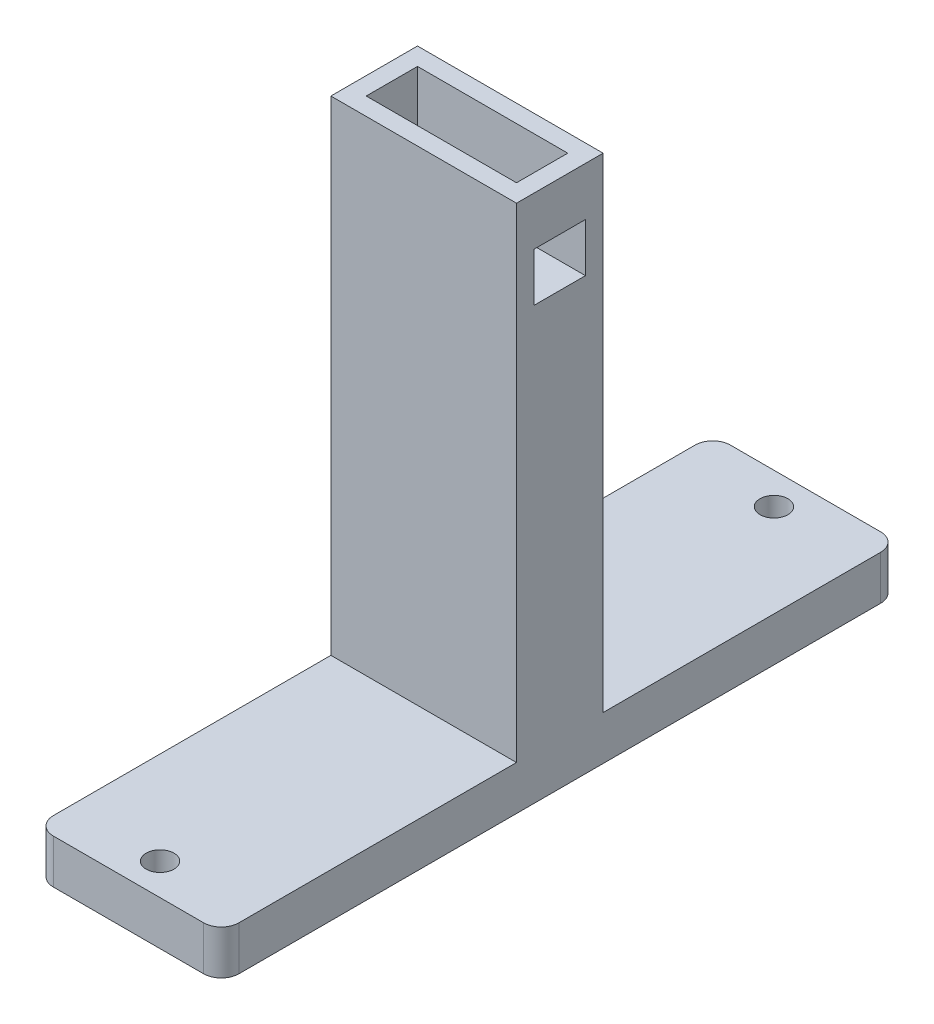
ISO-10303-21;
HEADER;
FILE_DESCRIPTION(('STEP AP214'),'2;1');
FILE_NAME('part.step','',(''),(''),'','','');
FILE_SCHEMA(('AUTOMOTIVE_DESIGN { 1 0 10303 214 1 1 1 1 }'));
ENDSEC;
DATA;
#1=APPLICATION_CONTEXT('core data for automotive mechanical design processes');
#2=APPLICATION_PROTOCOL_DEFINITION('international standard','automotive_design',2000,#1);
#3=PRODUCT_CONTEXT('',#1,'mechanical');
#4=PRODUCT('Part','Part','',(#3));
#5=PRODUCT_RELATED_PRODUCT_CATEGORY('part','',(#4));
#6=PRODUCT_DEFINITION_FORMATION('','',#4);
#7=PRODUCT_DEFINITION_CONTEXT('part definition',#1,'design');
#8=PRODUCT_DEFINITION('design','',#6,#7);
#9=PRODUCT_DEFINITION_SHAPE('','',#8);
#10=(LENGTH_UNIT() NAMED_UNIT(*) SI_UNIT(.MILLI.,.METRE.));
#11=(NAMED_UNIT(*) PLANE_ANGLE_UNIT() SI_UNIT($,.RADIAN.));
#12=(NAMED_UNIT(*) SI_UNIT($,.STERADIAN.) SOLID_ANGLE_UNIT());
#13=UNCERTAINTY_MEASURE_WITH_UNIT(LENGTH_MEASURE(1.E-05),#10,'distance_accuracy_value','');
#14=(GEOMETRIC_REPRESENTATION_CONTEXT(3) GLOBAL_UNCERTAINTY_ASSIGNED_CONTEXT((#13)) GLOBAL_UNIT_ASSIGNED_CONTEXT((#10,
#11,#12)) REPRESENTATION_CONTEXT('',''));
#15=CARTESIAN_POINT('',(0.,0.,0.));
#16=DIRECTION('',(0.,0.,1.));
#17=DIRECTION('',(1.,0.,0.));
#18=AXIS2_PLACEMENT_3D('',#15,#16,#17);
#19=CARTESIAN_POINT('',(-10.795,6.35,-46.101));
#20=DIRECTION('',(0.,-1.,0.));
#21=DIRECTION('',(0.,0.,-1.));
#22=AXIS2_PLACEMENT_3D('',#19,#20,#21);
#23=CYLINDRICAL_SURFACE('',#22,2.54);
#24=CARTESIAN_POINT('',(-10.795,0.,-46.101));
#25=DIRECTION('',(0.,1.,0.));
#26=DIRECTION('',(0.,0.,1.));
#27=AXIS2_PLACEMENT_3D('',#24,#25,#26);
#28=CIRCLE('',#27,2.54);
#29=CARTESIAN_POINT('',(-13.335,0.,-46.101));
#30=VERTEX_POINT('',#29);
#31=CARTESIAN_POINT('',(-10.795,0.,-48.641));
#32=VERTEX_POINT('',#31);
#33=EDGE_CURVE('E358',#30,#32,#28,.F.);
#34=ORIENTED_EDGE('',*,*,#33,.F.);
#35=DIRECTION('',(0.,-1.,0.));
#36=VECTOR('',#35,1.);
#37=CARTESIAN_POINT('',(-13.335,6.35,-46.101));
#38=LINE('',#37,#36);
#39=CARTESIAN_POINT('',(-13.335,6.35,-46.101));
#40=VERTEX_POINT('',#39);
#41=EDGE_CURVE('E11',#40,#30,#38,.T.);
#42=ORIENTED_EDGE('',*,*,#41,.F.);
#43=CARTESIAN_POINT('',(-10.795,6.35,-46.101));
#44=DIRECTION('',(0.,1.,0.));
#45=DIRECTION('',(0.,0.,1.));
#46=AXIS2_PLACEMENT_3D('',#43,#44,#45);
#47=CIRCLE('',#46,2.54);
#48=CARTESIAN_POINT('',(-10.795,6.35,-48.641));
#49=VERTEX_POINT('',#48);
#50=EDGE_CURVE('E330',#40,#49,#47,.F.);
#51=ORIENTED_EDGE('',*,*,#50,.T.);
#52=DIRECTION('',(0.,-1.,0.));
#53=VECTOR('',#52,1.);
#54=CARTESIAN_POINT('',(-10.795,6.35,-48.641));
#55=LINE('',#54,#53);
#56=EDGE_CURVE('E354',#49,#32,#55,.T.);
#57=ORIENTED_EDGE('',*,*,#56,.T.);
#58=EDGE_LOOP('',(#34,#42,#51,#57));
#59=FACE_BOUND('',#58,.T.);
#60=ADVANCED_FACE('F47',(#59),#23,.T.);
#61=CARTESIAN_POINT('',(-13.335,6.35,0.));
#62=DIRECTION('',(-1.,0.,0.));
#63=DIRECTION('',(0.,0.,1.));
#64=AXIS2_PLACEMENT_3D('',#61,#62,#63);
#65=PLANE('',#64);
#66=DIRECTION('',(0.,0.,-1.));
#67=VECTOR('',#66,1.);
#68=CARTESIAN_POINT('',(-13.335,0.,0.));
#69=LINE('',#68,#67);
#70=CARTESIAN_POINT('',(-13.335,0.,46.101));
#71=VERTEX_POINT('',#70);
#72=EDGE_CURVE('E362',#71,#30,#69,.T.);
#73=ORIENTED_EDGE('',*,*,#72,.F.);
#74=DIRECTION('',(0.,-1.,0.));
#75=VECTOR('',#74,1.);
#76=CARTESIAN_POINT('',(-13.335,6.35,46.101));
#77=LINE('',#76,#75);
#78=CARTESIAN_POINT('',(-13.335,6.35,46.101));
#79=VERTEX_POINT('',#78);
#80=EDGE_CURVE('E306',#79,#71,#77,.T.);
#81=ORIENTED_EDGE('',*,*,#80,.F.);
#82=DIRECTION('',(0.,0.,1.));
#83=VECTOR('',#82,1.);
#84=CARTESIAN_POINT('',(-13.335,6.35,0.));
#85=LINE('',#84,#83);
#86=CARTESIAN_POINT('',(-13.335,6.35,6.223));
#87=VERTEX_POINT('',#86);
#88=EDGE_CURVE('E256',#87,#79,#85,.T.);
#89=ORIENTED_EDGE('',*,*,#88,.F.);
#90=DIRECTION('',(0.,-1.,0.));
#91=VECTOR('',#90,1.);
#92=CARTESIAN_POINT('',(-13.335,61.976,6.223));
#93=LINE('',#92,#91);
#94=CARTESIAN_POINT('',(-13.335,75.946,6.223));
#95=VERTEX_POINT('',#94);
#96=EDGE_CURVE('E310',#95,#87,#93,.T.);
#97=ORIENTED_EDGE('',*,*,#96,.F.);
#98=DIRECTION('',(0.,0.,1.));
#99=VECTOR('',#98,1.);
#100=CARTESIAN_POINT('',(-13.335,75.946,-6.223));
#101=LINE('',#100,#99);
#102=CARTESIAN_POINT('',(-13.335,75.946,-6.223));
#103=VERTEX_POINT('',#102);
#104=EDGE_CURVE('E239',#103,#95,#101,.T.);
#105=ORIENTED_EDGE('',*,*,#104,.F.);
#106=DIRECTION('',(0.,-1.,0.));
#107=VECTOR('',#106,1.);
#108=CARTESIAN_POINT('',(-13.335,61.976,-6.223));
#109=LINE('',#108,#107);
#110=CARTESIAN_POINT('',(-13.335,6.35,-6.223));
#111=VERTEX_POINT('',#110);
#112=EDGE_CURVE('E313',#103,#111,#109,.T.);
#113=ORIENTED_EDGE('',*,*,#112,.T.);
#114=DIRECTION('',(0.,0.,-1.));
#115=VECTOR('',#114,1.);
#116=CARTESIAN_POINT('',(-13.335,6.35,0.));
#117=LINE('',#116,#115);
#118=EDGE_CURVE('E335',#111,#40,#117,.T.);
#119=ORIENTED_EDGE('',*,*,#118,.T.);
#120=ORIENTED_EDGE('',*,*,#41,.T.);
#121=EDGE_LOOP('',(#73,#81,#89,#97,#105,#113,#119,#120));
#122=FACE_BOUND('',#121,.T.);
#123=ADVANCED_FACE('F411',(#122),#65,.T.);
#124=CARTESIAN_POINT('',(13.335,6.35,0.));
#125=DIRECTION('',(-1.,0.,0.));
#126=DIRECTION('',(0.,0.,1.));
#127=AXIS2_PLACEMENT_3D('',#124,#125,#126);
#128=PLANE('',#127);
#129=DIRECTION('',(0.,0.,-1.));
#130=VECTOR('',#129,1.);
#131=CARTESIAN_POINT('',(13.335,61.976,3.68299999999999));
#132=LINE('',#131,#130);
#133=CARTESIAN_POINT('',(13.335,61.976,3.68299999999999));
#134=VERTEX_POINT('',#133);
#135=CARTESIAN_POINT('',(13.335,61.976,-3.68300000000001));
#136=VERTEX_POINT('',#135);
#137=EDGE_CURVE('E183',#134,#136,#132,.T.);
#138=ORIENTED_EDGE('',*,*,#137,.F.);
#139=DIRECTION('',(0.,-1.,0.));
#140=VECTOR('',#139,1.);
#141=CARTESIAN_POINT('',(13.335,68.961,3.683));
#142=LINE('',#141,#140);
#143=CARTESIAN_POINT('',(13.335,68.961,3.683));
#144=VERTEX_POINT('',#143);
#145=EDGE_CURVE('E188',#144,#134,#142,.T.);
#146=ORIENTED_EDGE('',*,*,#145,.F.);
#147=DIRECTION('',(0.,0.,1.));
#148=VECTOR('',#147,1.);
#149=CARTESIAN_POINT('',(13.335,68.961,3.683));
#150=LINE('',#149,#148);
#151=CARTESIAN_POINT('',(13.335,68.961,-3.683));
#152=VERTEX_POINT('',#151);
#153=EDGE_CURVE('E193',#152,#144,#150,.T.);
#154=ORIENTED_EDGE('',*,*,#153,.F.);
#155=DIRECTION('',(0.,1.,0.));
#156=VECTOR('',#155,1.);
#157=CARTESIAN_POINT('',(13.335,68.961,-3.683));
#158=LINE('',#157,#156);
#159=EDGE_CURVE('E175',#136,#152,#158,.T.);
#160=ORIENTED_EDGE('',*,*,#159,.F.);
#161=EDGE_LOOP('',(#138,#146,#154,#160));
#162=FACE_BOUND('',#161,.T.);
#163=DIRECTION('',(0.,0.,-1.));
#164=VECTOR('',#163,1.);
#165=CARTESIAN_POINT('',(13.335,0.,0.));
#166=LINE('',#165,#164);
#167=CARTESIAN_POINT('',(13.335,0.,46.101));
#168=VERTEX_POINT('',#167);
#169=CARTESIAN_POINT('',(13.335,0.,-46.101));
#170=VERTEX_POINT('',#169);
#171=EDGE_CURVE('E366',#168,#170,#166,.T.);
#172=ORIENTED_EDGE('',*,*,#171,.T.);
#173=DIRECTION('',(0.,-1.,0.));
#174=VECTOR('',#173,1.);
#175=CARTESIAN_POINT('',(13.335,6.35,-46.101));
#176=LINE('',#175,#174);
#177=CARTESIAN_POINT('',(13.335,6.35,-46.101));
#178=VERTEX_POINT('',#177);
#179=EDGE_CURVE('E56',#178,#170,#176,.T.);
#180=ORIENTED_EDGE('',*,*,#179,.F.);
#181=DIRECTION('',(0.,0.,-1.));
#182=VECTOR('',#181,1.);
#183=CARTESIAN_POINT('',(13.335,6.35,0.));
#184=LINE('',#183,#182);
#185=CARTESIAN_POINT('',(13.335,6.35,-6.223));
#186=VERTEX_POINT('',#185);
#187=EDGE_CURVE('E343',#186,#178,#184,.T.);
#188=ORIENTED_EDGE('',*,*,#187,.F.);
#189=DIRECTION('',(0.,-1.,0.));
#190=VECTOR('',#189,1.);
#191=CARTESIAN_POINT('',(13.335,61.976,-6.223));
#192=LINE('',#191,#190);
#193=CARTESIAN_POINT('',(13.335,75.946,-6.223));
#194=VERTEX_POINT('',#193);
#195=EDGE_CURVE('E317',#194,#186,#192,.T.);
#196=ORIENTED_EDGE('',*,*,#195,.F.);
#197=DIRECTION('',(0.,0.,-1.));
#198=VECTOR('',#197,1.);
#199=CARTESIAN_POINT('',(13.335,75.946,-6.223));
#200=LINE('',#199,#198);
#201=CARTESIAN_POINT('',(13.335,75.946,6.223));
#202=VERTEX_POINT('',#201);
#203=EDGE_CURVE('E247',#202,#194,#200,.T.);
#204=ORIENTED_EDGE('',*,*,#203,.F.);
#205=DIRECTION('',(0.,-1.,0.));
#206=VECTOR('',#205,1.);
#207=CARTESIAN_POINT('',(13.335,61.976,6.223));
#208=LINE('',#207,#206);
#209=CARTESIAN_POINT('',(13.335,6.35,6.223));
#210=VERTEX_POINT('',#209);
#211=EDGE_CURVE('E321',#202,#210,#208,.T.);
#212=ORIENTED_EDGE('',*,*,#211,.T.);
#213=DIRECTION('',(0.,0.,1.));
#214=VECTOR('',#213,1.);
#215=CARTESIAN_POINT('',(13.335,6.35,0.));
#216=LINE('',#215,#214);
#217=CARTESIAN_POINT('',(13.335,6.35,46.101));
#218=VERTEX_POINT('',#217);
#219=EDGE_CURVE('E270',#210,#218,#216,.T.);
#220=ORIENTED_EDGE('',*,*,#219,.T.);
#221=DIRECTION('',(0.,-1.,0.));
#222=VECTOR('',#221,1.);
#223=CARTESIAN_POINT('',(13.335,6.35,46.101));
#224=LINE('',#223,#222);
#225=EDGE_CURVE('E282',#218,#168,#224,.T.);
#226=ORIENTED_EDGE('',*,*,#225,.T.);
#227=EDGE_LOOP('',(#172,#180,#188,#196,#204,#212,#220,#226));
#228=FACE_BOUND('',#227,.T.);
#229=ADVANCED_FACE('F190',(#162,#228),#128,.F.);
#230=CARTESIAN_POINT('',(10.795,6.35,-46.101));
#231=DIRECTION('',(0.,-1.,0.));
#232=DIRECTION('',(0.,0.,-1.));
#233=AXIS2_PLACEMENT_3D('',#230,#231,#232);
#234=CYLINDRICAL_SURFACE('',#233,2.54);
#235=CARTESIAN_POINT('',(10.795,0.,-46.101));
#236=DIRECTION('',(0.,1.,0.));
#237=DIRECTION('',(0.,0.,1.));
#238=AXIS2_PLACEMENT_3D('',#235,#236,#237);
#239=CIRCLE('',#238,2.54);
#240=CARTESIAN_POINT('',(10.795,0.,-48.641));
#241=VERTEX_POINT('',#240);
#242=EDGE_CURVE('E370',#241,#170,#239,.F.);
#243=ORIENTED_EDGE('',*,*,#242,.F.);
#244=DIRECTION('',(0.,-1.,0.));
#245=VECTOR('',#244,1.);
#246=CARTESIAN_POINT('',(10.795,6.35,-48.641));
#247=LINE('',#246,#245);
#248=CARTESIAN_POINT('',(10.795,6.35,-48.641));
#249=VERTEX_POINT('',#248);
#250=EDGE_CURVE('E379',#249,#241,#247,.T.);
#251=ORIENTED_EDGE('',*,*,#250,.F.);
#252=CARTESIAN_POINT('',(10.795,6.35,-46.101));
#253=DIRECTION('',(0.,1.,0.));
#254=DIRECTION('',(0.,0.,1.));
#255=AXIS2_PLACEMENT_3D('',#252,#253,#254);
#256=CIRCLE('',#255,2.54);
#257=EDGE_CURVE('E346',#249,#178,#256,.F.);
#258=ORIENTED_EDGE('',*,*,#257,.T.);
#259=ORIENTED_EDGE('',*,*,#179,.T.);
#260=EDGE_LOOP('',(#243,#251,#258,#259));
#261=FACE_BOUND('',#260,.T.);
#262=ADVANCED_FACE('F385',(#261),#234,.T.);
#263=CARTESIAN_POINT('',(0.,6.35,-44.101004));
#264=DIRECTION('',(0.,-1.,0.));
#265=DIRECTION('',(0.,0.,-1.));
#266=AXIS2_PLACEMENT_3D('',#263,#264,#265);
#267=CYLINDRICAL_SURFACE('',#266,2.);
#268=CARTESIAN_POINT('',(0.,6.35,-44.101004));
#269=DIRECTION('',(0.,1.,0.));
#270=DIRECTION('',(0.,0.,1.));
#271=AXIS2_PLACEMENT_3D('',#268,#269,#270);
#272=CIRCLE('',#271,2.);
#273=CARTESIAN_POINT('',(0.,6.35,-42.101004));
#274=VERTEX_POINT('',#273);
#275=EDGE_CURVE('E326',#274,#274,#272,.T.);
#276=ORIENTED_EDGE('',*,*,#275,.T.);
#277=EDGE_LOOP('',(#276));
#278=FACE_BOUND('',#277,.T.);
#279=CARTESIAN_POINT('',(0.,0.,-44.101004));
#280=DIRECTION('',(0.,1.,0.));
#281=DIRECTION('',(0.,0.,1.));
#282=AXIS2_PLACEMENT_3D('',#279,#280,#281);
#283=CIRCLE('',#282,2.);
#284=CARTESIAN_POINT('',(0.,0.,-42.101004));
#285=VERTEX_POINT('',#284);
#286=EDGE_CURVE('E325',#285,#285,#283,.T.);
#287=ORIENTED_EDGE('',*,*,#286,.F.);
#288=EDGE_LOOP('',(#287));
#289=FACE_BOUND('',#288,.T.);
#290=ADVANCED_FACE('F49',(#278,#289),#267,.F.);
#291=CARTESIAN_POINT('',(0.,6.35,-48.641));
#292=DIRECTION('',(0.,0.,-1.));
#293=DIRECTION('',(-1.,0.,0.));
#294=AXIS2_PLACEMENT_3D('',#291,#292,#293);
#295=PLANE('',#294);
#296=DIRECTION('',(1.,0.,0.));
#297=VECTOR('',#296,1.);
#298=CARTESIAN_POINT('',(0.,0.,-48.641));
#299=LINE('',#298,#297);
#300=EDGE_CURVE('E331',#32,#241,#299,.T.);
#301=ORIENTED_EDGE('',*,*,#300,.F.);
#302=ORIENTED_EDGE('',*,*,#56,.F.);
#303=DIRECTION('',(1.,0.,0.));
#304=VECTOR('',#303,1.);
#305=CARTESIAN_POINT('',(0.,6.35,-48.641));
#306=LINE('',#305,#304);
#307=EDGE_CURVE('E350',#49,#249,#306,.T.);
#308=ORIENTED_EDGE('',*,*,#307,.T.);
#309=ORIENTED_EDGE('',*,*,#250,.T.);
#310=EDGE_LOOP('',(#301,#302,#308,#309));
#311=FACE_BOUND('',#310,.T.);
#312=ADVANCED_FACE('F395',(#311),#295,.T.);
#313=CARTESIAN_POINT('',(0.,6.35,0.));
#314=DIRECTION('',(0.,1.,0.));
#315=DIRECTION('',(0.,0.,1.));
#316=AXIS2_PLACEMENT_3D('',#313,#314,#315);
#317=PLANE('',#316);
#318=ORIENTED_EDGE('',*,*,#275,.F.);
#319=EDGE_LOOP('',(#318));
#320=FACE_BOUND('',#319,.T.);
#321=ORIENTED_EDGE('',*,*,#50,.F.);
#322=ORIENTED_EDGE('',*,*,#118,.F.);
#323=DIRECTION('',(-1.,0.,0.));
#324=VECTOR('',#323,1.);
#325=CARTESIAN_POINT('',(0.,6.35,-6.223));
#326=LINE('',#325,#324);
#327=EDGE_CURVE('E339',#186,#111,#326,.T.);
#328=ORIENTED_EDGE('',*,*,#327,.F.);
#329=ORIENTED_EDGE('',*,*,#187,.T.);
#330=ORIENTED_EDGE('',*,*,#257,.F.);
#331=ORIENTED_EDGE('',*,*,#307,.F.);
#332=EDGE_LOOP('',(#321,#322,#328,#329,#330,#331));
#333=FACE_BOUND('',#332,.T.);
#334=ADVANCED_FACE('F399',(#320,#333),#317,.T.);
#335=CARTESIAN_POINT('',(0.,0.,0.));
#336=DIRECTION('',(0.,1.,0.));
#337=DIRECTION('',(0.,0.,1.));
#338=AXIS2_PLACEMENT_3D('',#335,#336,#337);
#339=PLANE('',#338);
#340=ORIENTED_EDGE('',*,*,#286,.T.);
#341=EDGE_LOOP('',(#340));
#342=FACE_BOUND('',#341,.T.);
#343=ORIENTED_EDGE('',*,*,#33,.T.);
#344=ORIENTED_EDGE('',*,*,#300,.T.);
#345=ORIENTED_EDGE('',*,*,#242,.T.);
#346=ORIENTED_EDGE('',*,*,#171,.F.);
#347=CARTESIAN_POINT('',(10.795,0.,46.101));
#348=DIRECTION('',(0.,1.,0.));
#349=DIRECTION('',(0.,0.,1.));
#350=AXIS2_PLACEMENT_3D('',#347,#348,#349);
#351=CIRCLE('',#350,2.54);
#352=CARTESIAN_POINT('',(10.795,0.,48.641));
#353=VERTEX_POINT('',#352);
#354=EDGE_CURVE('E288',#353,#168,#351,.T.);
#355=ORIENTED_EDGE('',*,*,#354,.F.);
#356=DIRECTION('',(1.,0.,0.));
#357=VECTOR('',#356,1.);
#358=CARTESIAN_POINT('',(0.,0.,48.641));
#359=LINE('',#358,#357);
#360=CARTESIAN_POINT('',(-10.795,0.,48.641));
#361=VERTEX_POINT('',#360);
#362=EDGE_CURVE('E285',#361,#353,#359,.T.);
#363=ORIENTED_EDGE('',*,*,#362,.F.);
#364=CARTESIAN_POINT('',(-10.795,0.,46.101));
#365=DIRECTION('',(0.,1.,0.));
#366=DIRECTION('',(0.,0.,1.));
#367=AXIS2_PLACEMENT_3D('',#364,#365,#366);
#368=CIRCLE('',#367,2.54);
#369=EDGE_CURVE('E255',#71,#361,#368,.T.);
#370=ORIENTED_EDGE('',*,*,#369,.F.);
#371=ORIENTED_EDGE('',*,*,#72,.T.);
#372=EDGE_LOOP('',(#343,#344,#345,#346,#355,#363,#370,#371));
#373=FACE_BOUND('',#372,.T.);
#374=CARTESIAN_POINT('',(0.,0.,44.101004));
#375=DIRECTION('',(0.,1.,0.));
#376=DIRECTION('',(0.,0.,1.));
#377=AXIS2_PLACEMENT_3D('',#374,#375,#376);
#378=CIRCLE('',#377,2.);
#379=CARTESIAN_POINT('',(0.,0.,46.101004));
#380=VERTEX_POINT('',#379);
#381=EDGE_CURVE('E261',#380,#380,#378,.F.);
#382=ORIENTED_EDGE('',*,*,#381,.F.);
#383=EDGE_LOOP('',(#382));
#384=FACE_BOUND('',#383,.T.);
#385=ADVANCED_FACE('F390',(#342,#373,#384),#339,.F.);
#386=CARTESIAN_POINT('',(0.,61.976,-6.223));
#387=DIRECTION('',(0.,0.,1.));
#388=DIRECTION('',(1.,0.,0.));
#389=AXIS2_PLACEMENT_3D('',#386,#387,#388);
#390=PLANE('',#389);
#391=ORIENTED_EDGE('',*,*,#195,.T.);
#392=ORIENTED_EDGE('',*,*,#327,.T.);
#393=ORIENTED_EDGE('',*,*,#112,.F.);
#394=DIRECTION('',(-1.,0.,0.));
#395=VECTOR('',#394,1.);
#396=CARTESIAN_POINT('',(-13.335,75.946,-6.223));
#397=LINE('',#396,#395);
#398=EDGE_CURVE('E251',#194,#103,#397,.T.);
#399=ORIENTED_EDGE('',*,*,#398,.F.);
#400=EDGE_LOOP('',(#391,#392,#393,#399));
#401=FACE_BOUND('',#400,.T.);
#402=ADVANCED_FACE('F409',(#401),#390,.F.);
#403=CARTESIAN_POINT('',(0.,61.976,6.223));
#404=DIRECTION('',(0.,0.,1.));
#405=DIRECTION('',(1.,0.,0.));
#406=AXIS2_PLACEMENT_3D('',#403,#404,#405);
#407=PLANE('',#406);
#408=DIRECTION('',(-1.,0.,0.));
#409=VECTOR('',#408,1.);
#410=CARTESIAN_POINT('',(0.,6.35,6.223));
#411=LINE('',#410,#409);
#412=EDGE_CURVE('E274',#210,#87,#411,.T.);
#413=ORIENTED_EDGE('',*,*,#412,.F.);
#414=ORIENTED_EDGE('',*,*,#211,.F.);
#415=DIRECTION('',(1.,0.,0.));
#416=VECTOR('',#415,1.);
#417=CARTESIAN_POINT('',(-13.335,75.946,6.223));
#418=LINE('',#417,#416);
#419=EDGE_CURVE('E243',#95,#202,#418,.T.);
#420=ORIENTED_EDGE('',*,*,#419,.F.);
#421=ORIENTED_EDGE('',*,*,#96,.T.);
#422=EDGE_LOOP('',(#413,#414,#420,#421));
#423=FACE_BOUND('',#422,.T.);
#424=ADVANCED_FACE('F415',(#423),#407,.T.);
#425=CARTESIAN_POINT('',(-10.795,6.35,46.101));
#426=DIRECTION('',(0.,-1.,0.));
#427=DIRECTION('',(0.,0.,-1.));
#428=AXIS2_PLACEMENT_3D('',#425,#426,#427);
#429=CYLINDRICAL_SURFACE('',#428,2.54);
#430=ORIENTED_EDGE('',*,*,#369,.T.);
#431=DIRECTION('',(0.,-1.,0.));
#432=VECTOR('',#431,1.);
#433=CARTESIAN_POINT('',(-10.795,6.35,48.641));
#434=LINE('',#433,#432);
#435=CARTESIAN_POINT('',(-10.795,6.35,48.641));
#436=VERTEX_POINT('',#435);
#437=EDGE_CURVE('E302',#436,#361,#434,.T.);
#438=ORIENTED_EDGE('',*,*,#437,.F.);
#439=CARTESIAN_POINT('',(-10.795,6.35,46.101));
#440=DIRECTION('',(0.,1.,0.));
#441=DIRECTION('',(0.,0.,1.));
#442=AXIS2_PLACEMENT_3D('',#439,#440,#441);
#443=CIRCLE('',#442,2.54);
#444=EDGE_CURVE('E260',#79,#436,#443,.T.);
#445=ORIENTED_EDGE('',*,*,#444,.F.);
#446=ORIENTED_EDGE('',*,*,#80,.T.);
#447=EDGE_LOOP('',(#430,#438,#445,#446));
#448=FACE_BOUND('',#447,.T.);
#449=ADVANCED_FACE('F431',(#448),#429,.T.);
#450=CARTESIAN_POINT('',(0.,6.35,48.641));
#451=DIRECTION('',(0.,0.,-1.));
#452=DIRECTION('',(-1.,0.,0.));
#453=AXIS2_PLACEMENT_3D('',#450,#451,#452);
#454=PLANE('',#453);
#455=ORIENTED_EDGE('',*,*,#362,.T.);
#456=DIRECTION('',(0.,-1.,0.));
#457=VECTOR('',#456,1.);
#458=CARTESIAN_POINT('',(10.795,6.35,48.641));
#459=LINE('',#458,#457);
#460=CARTESIAN_POINT('',(10.795,6.35,48.641));
#461=VERTEX_POINT('',#460);
#462=EDGE_CURVE('E298',#461,#353,#459,.T.);
#463=ORIENTED_EDGE('',*,*,#462,.F.);
#464=DIRECTION('',(1.,0.,0.));
#465=VECTOR('',#464,1.);
#466=CARTESIAN_POINT('',(0.,6.35,48.641));
#467=LINE('',#466,#465);
#468=EDGE_CURVE('E264',#436,#461,#467,.T.);
#469=ORIENTED_EDGE('',*,*,#468,.F.);
#470=ORIENTED_EDGE('',*,*,#437,.T.);
#471=EDGE_LOOP('',(#455,#463,#469,#470));
#472=FACE_BOUND('',#471,.T.);
#473=ADVANCED_FACE('F428',(#472),#454,.F.);
#474=CARTESIAN_POINT('',(10.795,6.35,46.101));
#475=DIRECTION('',(0.,-1.,0.));
#476=DIRECTION('',(0.,0.,-1.));
#477=AXIS2_PLACEMENT_3D('',#474,#475,#476);
#478=CYLINDRICAL_SURFACE('',#477,2.54);
#479=ORIENTED_EDGE('',*,*,#354,.T.);
#480=ORIENTED_EDGE('',*,*,#225,.F.);
#481=CARTESIAN_POINT('',(10.795,6.35,46.101));
#482=DIRECTION('',(0.,1.,0.));
#483=DIRECTION('',(0.,0.,1.));
#484=AXIS2_PLACEMENT_3D('',#481,#482,#483);
#485=CIRCLE('',#484,2.54);
#486=EDGE_CURVE('E267',#461,#218,#485,.T.);
#487=ORIENTED_EDGE('',*,*,#486,.F.);
#488=ORIENTED_EDGE('',*,*,#462,.T.);
#489=EDGE_LOOP('',(#479,#480,#487,#488));
#490=FACE_BOUND('',#489,.T.);
#491=ADVANCED_FACE('F424',(#490),#478,.T.);
#492=CARTESIAN_POINT('',(0.,6.35,44.101004));
#493=DIRECTION('',(0.,-1.,0.));
#494=DIRECTION('',(0.,0.,-1.));
#495=AXIS2_PLACEMENT_3D('',#492,#493,#494);
#496=CYLINDRICAL_SURFACE('',#495,2.);
#497=CARTESIAN_POINT('',(0.,6.35,44.101004));
#498=DIRECTION('',(0.,1.,0.));
#499=DIRECTION('',(0.,0.,1.));
#500=AXIS2_PLACEMENT_3D('',#497,#498,#499);
#501=CIRCLE('',#500,2.);
#502=CARTESIAN_POINT('',(0.,6.35,46.101004));
#503=VERTEX_POINT('',#502);
#504=EDGE_CURVE('E278',#503,#503,#501,.F.);
#505=ORIENTED_EDGE('',*,*,#504,.F.);
#506=EDGE_LOOP('',(#505));
#507=FACE_BOUND('',#506,.T.);
#508=ORIENTED_EDGE('',*,*,#381,.T.);
#509=EDGE_LOOP('',(#508));
#510=FACE_BOUND('',#509,.T.);
#511=ADVANCED_FACE('F464',(#507,#510),#496,.F.);
#512=CARTESIAN_POINT('',(0.,6.35,0.));
#513=DIRECTION('',(0.,1.,0.));
#514=DIRECTION('',(0.,0.,1.));
#515=AXIS2_PLACEMENT_3D('',#512,#513,#514);
#516=PLANE('',#515);
#517=ORIENTED_EDGE('',*,*,#88,.T.);
#518=ORIENTED_EDGE('',*,*,#444,.T.);
#519=ORIENTED_EDGE('',*,*,#468,.T.);
#520=ORIENTED_EDGE('',*,*,#486,.T.);
#521=ORIENTED_EDGE('',*,*,#219,.F.);
#522=ORIENTED_EDGE('',*,*,#412,.T.);
#523=EDGE_LOOP('',(#517,#518,#519,#520,#521,#522));
#524=FACE_BOUND('',#523,.T.);
#525=ORIENTED_EDGE('',*,*,#504,.T.);
#526=EDGE_LOOP('',(#525));
#527=FACE_BOUND('',#526,.T.);
#528=ADVANCED_FACE('F418',(#524,#527),#516,.T.);
#529=CARTESIAN_POINT('',(0.,75.946,0.));
#530=DIRECTION('',(0.,1.,0.));
#531=DIRECTION('',(0.,0.,1.));
#532=AXIS2_PLACEMENT_3D('',#529,#530,#531);
#533=PLANE('',#532);
#534=ORIENTED_EDGE('',*,*,#104,.T.);
#535=ORIENTED_EDGE('',*,*,#419,.T.);
#536=ORIENTED_EDGE('',*,*,#203,.T.);
#537=ORIENTED_EDGE('',*,*,#398,.T.);
#538=EDGE_LOOP('',(#534,#535,#536,#537));
#539=FACE_BOUND('',#538,.T.);
#540=DIRECTION('',(1.,0.,0.));
#541=VECTOR('',#540,1.);
#542=CARTESIAN_POINT('',(-10.795,75.946,3.683));
#543=LINE('',#542,#541);
#544=CARTESIAN_POINT('',(-10.795,75.946,3.683));
#545=VERTEX_POINT('',#544);
#546=CARTESIAN_POINT('',(10.795,75.946,3.683));
#547=VERTEX_POINT('',#546);
#548=EDGE_CURVE('E211',#545,#547,#543,.T.);
#549=ORIENTED_EDGE('',*,*,#548,.F.);
#550=DIRECTION('',(0.,0.,1.));
#551=VECTOR('',#550,1.);
#552=CARTESIAN_POINT('',(-10.795,75.946,-3.683));
#553=LINE('',#552,#551);
#554=CARTESIAN_POINT('',(-10.795,75.946,-3.683));
#555=VERTEX_POINT('',#554);
#556=EDGE_CURVE('E180',#555,#545,#553,.T.);
#557=ORIENTED_EDGE('',*,*,#556,.F.);
#558=DIRECTION('',(-1.,0.,0.));
#559=VECTOR('',#558,1.);
#560=CARTESIAN_POINT('',(-10.795,75.946,-3.683));
#561=LINE('',#560,#559);
#562=CARTESIAN_POINT('',(10.795,75.946,-3.683));
#563=VERTEX_POINT('',#562);
#564=EDGE_CURVE('E218',#563,#555,#561,.T.);
#565=ORIENTED_EDGE('',*,*,#564,.F.);
#566=DIRECTION('',(0.,0.,-1.));
#567=VECTOR('',#566,1.);
#568=CARTESIAN_POINT('',(10.795,75.946,-3.683));
#569=LINE('',#568,#567);
#570=EDGE_CURVE('E214',#547,#563,#569,.T.);
#571=ORIENTED_EDGE('',*,*,#570,.F.);
#572=EDGE_LOOP('',(#549,#557,#565,#571));
#573=FACE_BOUND('',#572,.T.);
#574=ADVANCED_FACE('F405',(#539,#573),#533,.T.);
#575=CARTESIAN_POINT('',(-10.795,75.946,-3.683));
#576=DIRECTION('',(1.,0.,0.));
#577=DIRECTION('',(0.,0.,-1.));
#578=AXIS2_PLACEMENT_3D('',#575,#576,#577);
#579=PLANE('',#578);
#580=DIRECTION('',(0.,0.,1.));
#581=VECTOR('',#580,1.);
#582=CARTESIAN_POINT('',(-10.795,61.976,-3.683));
#583=LINE('',#582,#581);
#584=CARTESIAN_POINT('',(-10.795,61.976,-3.683));
#585=VERTEX_POINT('',#584);
#586=CARTESIAN_POINT('',(-10.795,61.976,3.683));
#587=VERTEX_POINT('',#586);
#588=EDGE_CURVE('E68',#585,#587,#583,.T.);
#589=ORIENTED_EDGE('',*,*,#588,.F.);
#590=DIRECTION('',(0.,-1.,0.));
#591=VECTOR('',#590,1.);
#592=CARTESIAN_POINT('',(-10.795,75.946,-3.683));
#593=LINE('',#592,#591);
#594=EDGE_CURVE('E178',#555,#585,#593,.T.);
#595=ORIENTED_EDGE('',*,*,#594,.F.);
#596=ORIENTED_EDGE('',*,*,#556,.T.);
#597=DIRECTION('',(0.,-1.,0.));
#598=VECTOR('',#597,1.);
#599=CARTESIAN_POINT('',(-10.795,75.946,3.683));
#600=LINE('',#599,#598);
#601=EDGE_CURVE('E235',#545,#587,#600,.T.);
#602=ORIENTED_EDGE('',*,*,#601,.T.);
#603=EDGE_LOOP('',(#589,#595,#596,#602));
#604=FACE_BOUND('',#603,.T.);
#605=ADVANCED_FACE('F472',(#604),#579,.T.);
#606=CARTESIAN_POINT('',(-10.795,75.946,3.683));
#607=DIRECTION('',(0.,0.,-1.));
#608=DIRECTION('',(-1.,0.,0.));
#609=AXIS2_PLACEMENT_3D('',#606,#607,#608);
#610=PLANE('',#609);
#611=DIRECTION('',(0.,-1.,0.));
#612=VECTOR('',#611,1.);
#613=CARTESIAN_POINT('',(10.795,75.946,3.683));
#614=LINE('',#613,#612);
#615=CARTESIAN_POINT('',(10.795,68.961,3.683));
#616=VERTEX_POINT('',#615);
#617=EDGE_CURVE('E231',#547,#616,#614,.T.);
#618=ORIENTED_EDGE('',*,*,#617,.T.);
#619=DIRECTION('',(1.,0.,0.));
#620=VECTOR('',#619,1.);
#621=CARTESIAN_POINT('',(-0.635000000000007,68.961,3.68299999999999));
#622=LINE('',#621,#620);
#623=EDGE_CURVE('E201',#616,#144,#622,.T.);
#624=ORIENTED_EDGE('',*,*,#623,.T.);
#625=ORIENTED_EDGE('',*,*,#145,.T.);
#626=DIRECTION('',(1.,0.,0.));
#627=VECTOR('',#626,1.);
#628=CARTESIAN_POINT('',(-10.795,61.976,3.683));
#629=LINE('',#628,#627);
#630=EDGE_CURVE('E63',#587,#134,#629,.T.);
#631=ORIENTED_EDGE('',*,*,#630,.F.);
#632=ORIENTED_EDGE('',*,*,#601,.F.);
#633=ORIENTED_EDGE('',*,*,#548,.T.);
#634=EDGE_LOOP('',(#618,#624,#625,#631,#632,#633));
#635=FACE_BOUND('',#634,.T.);
#636=ADVANCED_FACE('F475',(#635),#610,.T.);
#637=CARTESIAN_POINT('',(10.795,75.946,-3.683));
#638=DIRECTION('',(-1.,0.,0.));
#639=DIRECTION('',(0.,0.,1.));
#640=AXIS2_PLACEMENT_3D('',#637,#638,#639);
#641=PLANE('',#640);
#642=DIRECTION('',(0.,0.,-1.));
#643=VECTOR('',#642,1.);
#644=CARTESIAN_POINT('',(10.795,68.961,-3.683));
#645=LINE('',#644,#643);
#646=CARTESIAN_POINT('',(10.795,68.961,-3.683));
#647=VERTEX_POINT('',#646);
#648=EDGE_CURVE('E204',#616,#647,#645,.T.);
#649=ORIENTED_EDGE('',*,*,#648,.F.);
#650=ORIENTED_EDGE('',*,*,#617,.F.);
#651=ORIENTED_EDGE('',*,*,#570,.T.);
#652=DIRECTION('',(0.,-1.,0.));
#653=VECTOR('',#652,1.);
#654=CARTESIAN_POINT('',(10.795,75.946,-3.683));
#655=LINE('',#654,#653);
#656=EDGE_CURVE('E227',#563,#647,#655,.T.);
#657=ORIENTED_EDGE('',*,*,#656,.T.);
#658=EDGE_LOOP('',(#649,#650,#651,#657));
#659=FACE_BOUND('',#658,.T.);
#660=ADVANCED_FACE('F479',(#659),#641,.T.);
#661=CARTESIAN_POINT('',(-10.795,75.946,-3.683));
#662=DIRECTION('',(0.,0.,1.));
#663=DIRECTION('',(1.,0.,0.));
#664=AXIS2_PLACEMENT_3D('',#661,#662,#663);
#665=PLANE('',#664);
#666=DIRECTION('',(-1.,0.,0.));
#667=VECTOR('',#666,1.);
#668=CARTESIAN_POINT('',(-10.795,61.976,-3.683));
#669=LINE('',#668,#667);
#670=EDGE_CURVE('E171',#136,#585,#669,.T.);
#671=ORIENTED_EDGE('',*,*,#670,.F.);
#672=ORIENTED_EDGE('',*,*,#159,.T.);
#673=DIRECTION('',(1.,0.,0.));
#674=VECTOR('',#673,1.);
#675=CARTESIAN_POINT('',(-0.635000000000004,68.961,-3.683));
#676=LINE('',#675,#674);
#677=EDGE_CURVE('E197',#647,#152,#676,.T.);
#678=ORIENTED_EDGE('',*,*,#677,.F.);
#679=ORIENTED_EDGE('',*,*,#656,.F.);
#680=ORIENTED_EDGE('',*,*,#564,.T.);
#681=ORIENTED_EDGE('',*,*,#594,.T.);
#682=EDGE_LOOP('',(#671,#672,#678,#679,#680,#681));
#683=FACE_BOUND('',#682,.T.);
#684=ADVANCED_FACE('F172',(#683),#665,.T.);
#685=CARTESIAN_POINT('',(0.,61.976,0.));
#686=DIRECTION('',(0.,1.,0.));
#687=DIRECTION('',(0.,0.,1.));
#688=AXIS2_PLACEMENT_3D('',#685,#686,#687);
#689=PLANE('',#688);
#690=ORIENTED_EDGE('',*,*,#670,.T.);
#691=ORIENTED_EDGE('',*,*,#588,.T.);
#692=ORIENTED_EDGE('',*,*,#630,.T.);
#693=ORIENTED_EDGE('',*,*,#137,.T.);
#694=EDGE_LOOP('',(#690,#691,#692,#693));
#695=FACE_BOUND('',#694,.T.);
#696=ADVANCED_FACE('F184',(#695),#689,.T.);
#697=CARTESIAN_POINT('',(-0.635000000000007,68.961,3.68299999999999));
#698=DIRECTION('',(0.,1.,0.));
#699=DIRECTION('',(0.,0.,1.));
#700=AXIS2_PLACEMENT_3D('',#697,#698,#699);
#701=PLANE('',#700);
#702=ORIENTED_EDGE('',*,*,#648,.T.);
#703=ORIENTED_EDGE('',*,*,#677,.T.);
#704=ORIENTED_EDGE('',*,*,#153,.T.);
#705=ORIENTED_EDGE('',*,*,#623,.F.);
#706=EDGE_LOOP('',(#702,#703,#704,#705));
#707=FACE_BOUND('',#706,.T.);
#708=ADVANCED_FACE('F457',(#707),#701,.F.);
#709=CLOSED_SHELL('',(#60,#123,#229,#262,#290,#312,#334,#385,#402,#424,#449,#473,#491,#511,#528,
#574,#605,#636,#660,#684,#696,#708));
#710=MANIFOLD_SOLID_BREP('B2',#709);
#711=ADVANCED_BREP_SHAPE_REPRESENTATION('',(#18,#710),#14);
#712=SHAPE_DEFINITION_REPRESENTATION(#9,#711);
ENDSEC;
END-ISO-10303-21;
